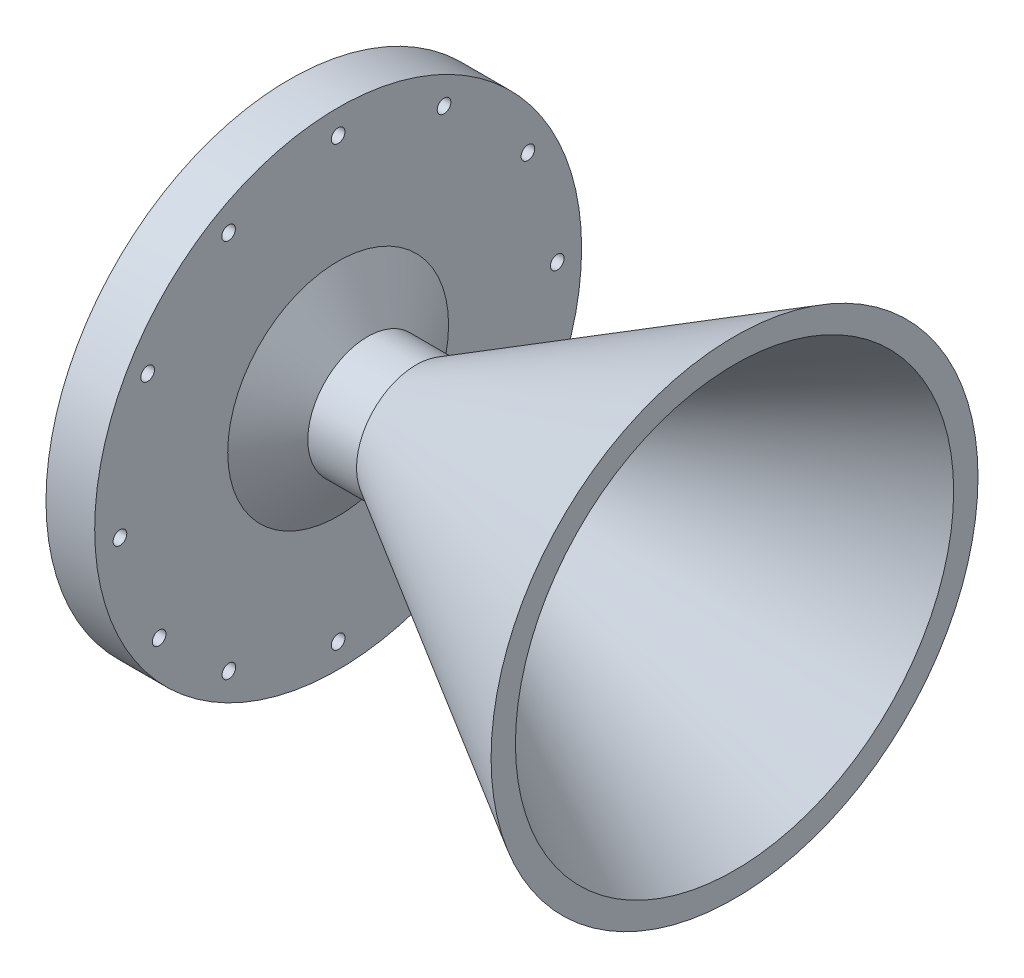
ISO-10303-21;
HEADER;
FILE_DESCRIPTION(('STEP AP214'),'2;1');
FILE_NAME('part.step','',(''),(''),'','','');
FILE_SCHEMA(('AUTOMOTIVE_DESIGN { 1 0 10303 214 1 1 1 1 }'));
ENDSEC;
DATA;
#1=APPLICATION_CONTEXT('core data for automotive mechanical design processes');
#2=APPLICATION_PROTOCOL_DEFINITION('international standard','automotive_design',2000,#1);
#3=PRODUCT_CONTEXT('',#1,'mechanical');
#4=PRODUCT('Part','Part','',(#3));
#5=PRODUCT_RELATED_PRODUCT_CATEGORY('part','',(#4));
#6=PRODUCT_DEFINITION_FORMATION('','',#4);
#7=PRODUCT_DEFINITION_CONTEXT('part definition',#1,'design');
#8=PRODUCT_DEFINITION('design','',#6,#7);
#9=PRODUCT_DEFINITION_SHAPE('','',#8);
#10=(LENGTH_UNIT() NAMED_UNIT(*) SI_UNIT(.MILLI.,.METRE.));
#11=(NAMED_UNIT(*) PLANE_ANGLE_UNIT() SI_UNIT($,.RADIAN.));
#12=(NAMED_UNIT(*) SI_UNIT($,.STERADIAN.) SOLID_ANGLE_UNIT());
#13=UNCERTAINTY_MEASURE_WITH_UNIT(LENGTH_MEASURE(1.E-05),#10,'distance_accuracy_value','');
#14=(GEOMETRIC_REPRESENTATION_CONTEXT(3) GLOBAL_UNCERTAINTY_ASSIGNED_CONTEXT((#13)) GLOBAL_UNIT_ASSIGNED_CONTEXT((#10,
#11,#12)) REPRESENTATION_CONTEXT('',''));
#15=CARTESIAN_POINT('',(0.,0.,0.));
#16=DIRECTION('',(0.,0.,1.));
#17=DIRECTION('',(1.,0.,0.));
#18=AXIS2_PLACEMENT_3D('',#15,#16,#17);
#19=CARTESIAN_POINT('',(0.,0.,0.));
#20=DIRECTION('',(-1.,0.,0.));
#21=DIRECTION('',(0.,0.,1.));
#22=AXIS2_PLACEMENT_3D('',#19,#20,#21);
#23=CYLINDRICAL_SURFACE('',#22,15.5575);
#24=CARTESIAN_POINT('',(-12.7,0.,0.));
#25=DIRECTION('',(-1.,0.,0.));
#26=DIRECTION('',(0.,0.,1.));
#27=AXIS2_PLACEMENT_3D('',#24,#25,#26);
#28=CIRCLE('',#27,15.5575);
#29=CARTESIAN_POINT('',(-12.7,0.,15.5575));
#30=VERTEX_POINT('',#29);
#31=EDGE_CURVE('E10',#30,#30,#28,.T.);
#32=ORIENTED_EDGE('',*,*,#31,.F.);
#33=EDGE_LOOP('',(#32));
#34=FACE_BOUND('',#33,.T.);
#35=CARTESIAN_POINT('',(0.,0.,0.));
#36=DIRECTION('',(-1.,0.,0.));
#37=DIRECTION('',(0.,0.,1.));
#38=AXIS2_PLACEMENT_3D('',#35,#36,#37);
#39=CIRCLE('',#38,15.5575);
#40=CARTESIAN_POINT('',(0.,0.,-15.5575));
#41=VERTEX_POINT('',#40);
#42=EDGE_CURVE('E65',#41,#41,#39,.T.);
#43=ORIENTED_EDGE('',*,*,#42,.T.);
#44=EDGE_LOOP('',(#43));
#45=FACE_BOUND('',#44,.T.);
#46=ADVANCED_FACE('F31',(#34,#45),#23,.T.);
#47=CARTESIAN_POINT('',(-12.7,0.,0.));
#48=DIRECTION('',(-1.,0.,0.));
#49=DIRECTION('',(0.,0.,1.));
#50=AXIS2_PLACEMENT_3D('',#47,#48,#49);
#51=CONICAL_SURFACE('',#50,15.5575,1.04719755119659);
#52=CARTESIAN_POINT('',(-20.3472668619156,0.,0.));
#53=DIRECTION('',(-1.,0.,0.));
#54=DIRECTION('',(0.,0.,1.));
#55=AXIS2_PLACEMENT_3D('',#52,#53,#54);
#56=CIRCLE('',#55,28.8029547438755);
#57=CARTESIAN_POINT('',(-20.3472668619156,0.,28.8029547438755));
#58=VERTEX_POINT('',#57);
#59=EDGE_CURVE('E37',#58,#58,#56,.T.);
#60=ORIENTED_EDGE('',*,*,#59,.F.);
#61=EDGE_LOOP('',(#60));
#62=FACE_BOUND('',#61,.T.);
#63=ORIENTED_EDGE('',*,*,#31,.T.);
#64=EDGE_LOOP('',(#63));
#65=FACE_BOUND('',#64,.T.);
#66=ADVANCED_FACE('F189',(#62,#65),#51,.T.);
#67=CARTESIAN_POINT('',(-20.3472668619156,63.5,0.));
#68=DIRECTION('',(-1.,0.,0.));
#69=DIRECTION('',(0.,0.,1.));
#70=AXIS2_PLACEMENT_3D('',#67,#68,#69);
#71=PLANE('',#70);
#72=CARTESIAN_POINT('',(-20.3472668619156,-5.20556958766426,56.9124287416025));
#73=DIRECTION('',(-1.,0.,0.));
#74=DIRECTION('',(0.,0.,1.));
#75=AXIS2_PLACEMENT_3D('',#72,#73,#74);
#76=CIRCLE('',#75,1.778);
#77=CARTESIAN_POINT('',(-20.3472668619156,-5.20556958766426,58.6904287416025));
#78=VERTEX_POINT('',#77);
#79=EDGE_CURVE('E68',#78,#78,#76,.T.);
#80=ORIENTED_EDGE('',*,*,#79,.T.);
#81=EDGE_LOOP('',(#80));
#82=FACE_BOUND('',#81,.T.);
#83=CARTESIAN_POINT('',(-20.3472668619156,-57.15,0.));
#84=DIRECTION('',(-1.,0.,0.));
#85=DIRECTION('',(0.,0.,1.));
#86=AXIS2_PLACEMENT_3D('',#83,#84,#85);
#87=CIRCLE('',#86,1.778);
#88=CARTESIAN_POINT('',(-20.3472668619156,-57.15,1.778));
#89=VERTEX_POINT('',#88);
#90=EDGE_CURVE('E122',#89,#89,#87,.T.);
#91=ORIENTED_EDGE('',*,*,#90,.T.);
#92=EDGE_LOOP('',(#91));
#93=FACE_BOUND('',#92,.T.);
#94=CARTESIAN_POINT('',(-20.3472668619156,-49.5367663729066,28.4996715299681));
#95=DIRECTION('',(-1.,0.,0.));
#96=DIRECTION('',(0.,0.,1.));
#97=AXIS2_PLACEMENT_3D('',#94,#95,#96);
#98=CIRCLE('',#97,1.778);
#99=CARTESIAN_POINT('',(-20.3472668619156,-49.5367663729066,30.2776715299681));
#100=VERTEX_POINT('',#99);
#101=EDGE_CURVE('E128',#100,#100,#98,.T.);
#102=ORIENTED_EDGE('',*,*,#101,.T.);
#103=EDGE_LOOP('',(#102));
#104=FACE_BOUND('',#103,.T.);
#105=CARTESIAN_POINT('',(-20.3472668619156,-32.9643698748863,46.6848242874672));
#106=DIRECTION('',(-1.,0.,0.));
#107=DIRECTION('',(0.,0.,1.));
#108=AXIS2_PLACEMENT_3D('',#105,#106,#107);
#109=CIRCLE('',#108,1.778);
#110=CARTESIAN_POINT('',(-20.3472668619156,-32.9643698748863,48.4628242874672));
#111=VERTEX_POINT('',#110);
#112=EDGE_CURVE('E99',#111,#111,#109,.T.);
#113=ORIENTED_EDGE('',*,*,#112,.T.);
#114=EDGE_LOOP('',(#113));
#115=FACE_BOUND('',#114,.T.);
#116=CARTESIAN_POINT('',(-20.3472668619156,28.5750000000002,-49.4933518262805));
#117=DIRECTION('',(-1.,0.,0.));
#118=DIRECTION('',(0.,0.,1.));
#119=AXIS2_PLACEMENT_3D('',#116,#117,#118);
#120=CIRCLE('',#119,1.778);
#121=CARTESIAN_POINT('',(-20.3472668619156,28.5750000000002,-47.7153518262805));
#122=VERTEX_POINT('',#121);
#123=EDGE_CURVE('E86',#122,#122,#120,.T.);
#124=ORIENTED_EDGE('',*,*,#123,.T.);
#125=EDGE_LOOP('',(#124));
#126=FACE_BOUND('',#125,.T.);
#127=CARTESIAN_POINT('',(-20.3472668619156,50.0348664276743,-27.6158404102571));
#128=DIRECTION('',(-1.,0.,0.));
#129=DIRECTION('',(0.,0.,1.));
#130=AXIS2_PLACEMENT_3D('',#127,#128,#129);
#131=CIRCLE('',#130,1.778);
#132=CARTESIAN_POINT('',(-20.3472668619156,50.0348664276743,-25.8378404102571));
#133=VERTEX_POINT('',#132);
#134=EDGE_CURVE('E73',#133,#133,#131,.T.);
#135=ORIENTED_EDGE('',*,*,#134,.T.);
#136=EDGE_LOOP('',(#135));
#137=FACE_BOUND('',#136,.T.);
#138=CARTESIAN_POINT('',(-20.3472668619156,0.,-57.15));
#139=DIRECTION('',(-1.,0.,0.));
#140=DIRECTION('',(0.,0.,1.));
#141=AXIS2_PLACEMENT_3D('',#138,#139,#140);
#142=CIRCLE('',#141,1.778);
#143=CARTESIAN_POINT('',(-20.3472668619156,0.,-55.372));
#144=VERTEX_POINT('',#143);
#145=EDGE_CURVE('E72',#144,#144,#142,.T.);
#146=ORIENTED_EDGE('',*,*,#145,.T.);
#147=EDGE_LOOP('',(#146));
#148=FACE_BOUND('',#147,.T.);
#149=CARTESIAN_POINT('',(-20.3472668619156,57.15,0.));
#150=DIRECTION('',(-1.,0.,0.));
#151=DIRECTION('',(0.,0.,1.));
#152=AXIS2_PLACEMENT_3D('',#149,#150,#151);
#153=CIRCLE('',#152,1.778);
#154=CARTESIAN_POINT('',(-20.3472668619156,57.15,1.778));
#155=VERTEX_POINT('',#154);
#156=EDGE_CURVE('E79',#155,#155,#153,.T.);
#157=ORIENTED_EDGE('',*,*,#156,.T.);
#158=EDGE_LOOP('',(#157));
#159=FACE_BOUND('',#158,.T.);
#160=CARTESIAN_POINT('',(-20.3472668619156,49.4933518262806,28.5750000000001));
#161=DIRECTION('',(-1.,0.,0.));
#162=DIRECTION('',(0.,0.,1.));
#163=AXIS2_PLACEMENT_3D('',#160,#161,#162);
#164=CIRCLE('',#163,1.778);
#165=CARTESIAN_POINT('',(-20.3472668619156,49.4933518262806,30.3530000000001));
#166=VERTEX_POINT('',#165);
#167=EDGE_CURVE('E87',#166,#166,#164,.T.);
#168=ORIENTED_EDGE('',*,*,#167,.T.);
#169=EDGE_LOOP('',(#168));
#170=FACE_BOUND('',#169,.T.);
#171=CARTESIAN_POINT('',(-20.3472668619156,28.2442482531311,49.6828435238514));
#172=DIRECTION('',(-1.,0.,0.));
#173=DIRECTION('',(0.,0.,1.));
#174=AXIS2_PLACEMENT_3D('',#171,#172,#173);
#175=CIRCLE('',#174,1.778);
#176=CARTESIAN_POINT('',(-20.3472668619156,28.2442482531311,51.4608435238514));
#177=VERTEX_POINT('',#176);
#178=EDGE_CURVE('E111',#177,#177,#175,.T.);
#179=ORIENTED_EDGE('',*,*,#178,.T.);
#180=EDGE_LOOP('',(#179));
#181=FACE_BOUND('',#180,.T.);
#182=CARTESIAN_POINT('',(-20.3472668619156,-48.3169724601523,-30.5220030844124));
#183=DIRECTION('',(-1.,0.,0.));
#184=DIRECTION('',(0.,0.,1.));
#185=AXIS2_PLACEMENT_3D('',#182,#183,#184);
#186=CIRCLE('',#185,1.778);
#187=CARTESIAN_POINT('',(-20.3472668619156,-48.3169724601523,-28.7440030844124));
#188=VERTEX_POINT('',#187);
#189=EDGE_CURVE('E105',#188,#188,#186,.T.);
#190=ORIENTED_EDGE('',*,*,#189,.T.);
#191=EDGE_LOOP('',(#190));
#192=FACE_BOUND('',#191,.T.);
#193=CARTESIAN_POINT('',(-20.3472668619156,-27.6158404102573,-50.0348664276742));
#194=DIRECTION('',(-1.,0.,0.));
#195=DIRECTION('',(0.,0.,1.));
#196=AXIS2_PLACEMENT_3D('',#193,#194,#195);
#197=CIRCLE('',#196,1.778);
#198=CARTESIAN_POINT('',(-20.3472668619156,-27.6158404102573,-48.2568664276742));
#199=VERTEX_POINT('',#198);
#200=EDGE_CURVE('E98',#199,#199,#197,.T.);
#201=ORIENTED_EDGE('',*,*,#200,.T.);
#202=EDGE_LOOP('',(#201));
#203=FACE_BOUND('',#202,.T.);
#204=CARTESIAN_POINT('',(-20.3472668619156,0.,0.));
#205=DIRECTION('',(-1.,0.,0.));
#206=DIRECTION('',(0.,0.,1.));
#207=AXIS2_PLACEMENT_3D('',#204,#205,#206);
#208=CIRCLE('',#207,63.5);
#209=CARTESIAN_POINT('',(-20.3472668619156,0.,63.5));
#210=VERTEX_POINT('',#209);
#211=EDGE_CURVE('E41',#210,#210,#208,.T.);
#212=ORIENTED_EDGE('',*,*,#211,.F.);
#213=EDGE_LOOP('',(#212));
#214=FACE_BOUND('',#213,.T.);
#215=ORIENTED_EDGE('',*,*,#59,.T.);
#216=EDGE_LOOP('',(#215));
#217=FACE_BOUND('',#216,.T.);
#218=ADVANCED_FACE('F141',(#82,#93,#104,#115,#126,#137,#148,#159,#170,#181,#192,#203,#214,#217),
#71,.F.);
#219=CARTESIAN_POINT('',(0.,0.,0.));
#220=DIRECTION('',(-1.,0.,0.));
#221=DIRECTION('',(0.,0.,1.));
#222=AXIS2_PLACEMENT_3D('',#219,#220,#221);
#223=CYLINDRICAL_SURFACE('',#222,63.5);
#224=CARTESIAN_POINT('',(-33.0472668619156,0.,0.));
#225=DIRECTION('',(-1.,0.,0.));
#226=DIRECTION('',(0.,0.,1.));
#227=AXIS2_PLACEMENT_3D('',#224,#225,#226);
#228=CIRCLE('',#227,63.5);
#229=CARTESIAN_POINT('',(-33.0472668619156,0.,63.5));
#230=VERTEX_POINT('',#229);
#231=EDGE_CURVE('E45',#230,#230,#228,.T.);
#232=ORIENTED_EDGE('',*,*,#231,.F.);
#233=EDGE_LOOP('',(#232));
#234=FACE_BOUND('',#233,.T.);
#235=ORIENTED_EDGE('',*,*,#211,.T.);
#236=EDGE_LOOP('',(#235));
#237=FACE_BOUND('',#236,.T.);
#238=ADVANCED_FACE('F155',(#234,#237),#223,.T.);
#239=CARTESIAN_POINT('',(-33.0472668619156,50.8,0.));
#240=DIRECTION('',(1.,0.,0.));
#241=DIRECTION('',(0.,0.,-1.));
#242=AXIS2_PLACEMENT_3D('',#239,#240,#241);
#243=PLANE('',#242);
#244=CARTESIAN_POINT('',(-33.0472668619156,-5.20556958766426,56.9124287416025));
#245=DIRECTION('',(-1.,0.,0.));
#246=DIRECTION('',(0.,0.,1.));
#247=AXIS2_PLACEMENT_3D('',#244,#245,#246);
#248=CIRCLE('',#247,1.778);
#249=CARTESIAN_POINT('',(-33.0472668619156,-5.20556958766426,58.6904287416025));
#250=VERTEX_POINT('',#249);
#251=EDGE_CURVE('E82',#250,#250,#248,.T.);
#252=ORIENTED_EDGE('',*,*,#251,.F.);
#253=EDGE_LOOP('',(#252));
#254=FACE_BOUND('',#253,.T.);
#255=CARTESIAN_POINT('',(-33.0472668619156,-57.15,0.));
#256=DIRECTION('',(-1.,0.,0.));
#257=DIRECTION('',(0.,0.,1.));
#258=AXIS2_PLACEMENT_3D('',#255,#256,#257);
#259=CIRCLE('',#258,1.778);
#260=CARTESIAN_POINT('',(-33.0472668619156,-57.15,1.778));
#261=VERTEX_POINT('',#260);
#262=EDGE_CURVE('E119',#261,#261,#259,.T.);
#263=ORIENTED_EDGE('',*,*,#262,.F.);
#264=EDGE_LOOP('',(#263));
#265=FACE_BOUND('',#264,.T.);
#266=CARTESIAN_POINT('',(-33.0472668619156,-49.5367663729066,28.4996715299681));
#267=DIRECTION('',(-1.,0.,0.));
#268=DIRECTION('',(0.,0.,1.));
#269=AXIS2_PLACEMENT_3D('',#266,#267,#268);
#270=CIRCLE('',#269,1.778);
#271=CARTESIAN_POINT('',(-33.0472668619156,-49.5367663729066,30.2776715299681));
#272=VERTEX_POINT('',#271);
#273=EDGE_CURVE('E125',#272,#272,#270,.T.);
#274=ORIENTED_EDGE('',*,*,#273,.F.);
#275=EDGE_LOOP('',(#274));
#276=FACE_BOUND('',#275,.T.);
#277=CARTESIAN_POINT('',(-33.0472668619156,-32.9643698748863,46.6848242874672));
#278=DIRECTION('',(-1.,0.,0.));
#279=DIRECTION('',(0.,0.,1.));
#280=AXIS2_PLACEMENT_3D('',#277,#278,#279);
#281=CIRCLE('',#280,1.778);
#282=CARTESIAN_POINT('',(-33.0472668619156,-32.9643698748863,48.4628242874672));
#283=VERTEX_POINT('',#282);
#284=EDGE_CURVE('E131',#283,#283,#281,.T.);
#285=ORIENTED_EDGE('',*,*,#284,.F.);
#286=EDGE_LOOP('',(#285));
#287=FACE_BOUND('',#286,.T.);
#288=CARTESIAN_POINT('',(-33.0472668619156,28.5750000000002,-49.4933518262805));
#289=DIRECTION('',(-1.,0.,0.));
#290=DIRECTION('',(0.,0.,1.));
#291=AXIS2_PLACEMENT_3D('',#288,#289,#290);
#292=CIRCLE('',#291,1.778);
#293=CARTESIAN_POINT('',(-33.0472668619156,28.5750000000002,-47.7153518262805));
#294=VERTEX_POINT('',#293);
#295=EDGE_CURVE('E83',#294,#294,#292,.T.);
#296=ORIENTED_EDGE('',*,*,#295,.F.);
#297=EDGE_LOOP('',(#296));
#298=FACE_BOUND('',#297,.T.);
#299=CARTESIAN_POINT('',(-33.0472668619156,50.0348664276743,-27.6158404102571));
#300=DIRECTION('',(-1.,0.,0.));
#301=DIRECTION('',(0.,0.,1.));
#302=AXIS2_PLACEMENT_3D('',#299,#300,#301);
#303=CIRCLE('',#302,1.778);
#304=CARTESIAN_POINT('',(-33.0472668619156,50.0348664276743,-25.8378404102571));
#305=VERTEX_POINT('',#304);
#306=EDGE_CURVE('E90',#305,#305,#303,.T.);
#307=ORIENTED_EDGE('',*,*,#306,.F.);
#308=EDGE_LOOP('',(#307));
#309=FACE_BOUND('',#308,.T.);
#310=CARTESIAN_POINT('',(-33.0472668619156,0.,-57.15));
#311=DIRECTION('',(-1.,0.,0.));
#312=DIRECTION('',(0.,0.,1.));
#313=AXIS2_PLACEMENT_3D('',#310,#311,#312);
#314=CIRCLE('',#313,1.778);
#315=CARTESIAN_POINT('',(-33.0472668619156,0.,-55.372));
#316=VERTEX_POINT('',#315);
#317=EDGE_CURVE('E69',#316,#316,#314,.T.);
#318=ORIENTED_EDGE('',*,*,#317,.F.);
#319=EDGE_LOOP('',(#318));
#320=FACE_BOUND('',#319,.T.);
#321=CARTESIAN_POINT('',(-33.0472668619156,57.15,0.));
#322=DIRECTION('',(-1.,0.,0.));
#323=DIRECTION('',(0.,0.,1.));
#324=AXIS2_PLACEMENT_3D('',#321,#322,#323);
#325=CIRCLE('',#324,1.778);
#326=CARTESIAN_POINT('',(-33.0472668619156,57.15,1.778));
#327=VERTEX_POINT('',#326);
#328=EDGE_CURVE('E76',#327,#327,#325,.T.);
#329=ORIENTED_EDGE('',*,*,#328,.F.);
#330=EDGE_LOOP('',(#329));
#331=FACE_BOUND('',#330,.T.);
#332=CARTESIAN_POINT('',(-33.0472668619156,49.4933518262806,28.5750000000001));
#333=DIRECTION('',(-1.,0.,0.));
#334=DIRECTION('',(0.,0.,1.));
#335=AXIS2_PLACEMENT_3D('',#332,#333,#334);
#336=CIRCLE('',#335,1.778);
#337=CARTESIAN_POINT('',(-33.0472668619156,49.4933518262806,30.3530000000001));
#338=VERTEX_POINT('',#337);
#339=EDGE_CURVE('E114',#338,#338,#336,.T.);
#340=ORIENTED_EDGE('',*,*,#339,.F.);
#341=EDGE_LOOP('',(#340));
#342=FACE_BOUND('',#341,.T.);
#343=CARTESIAN_POINT('',(-33.0472668619156,28.2442482531311,49.6828435238514));
#344=DIRECTION('',(-1.,0.,0.));
#345=DIRECTION('',(0.,0.,1.));
#346=AXIS2_PLACEMENT_3D('',#343,#344,#345);
#347=CIRCLE('',#346,1.778);
#348=CARTESIAN_POINT('',(-33.0472668619156,28.2442482531311,51.4608435238514));
#349=VERTEX_POINT('',#348);
#350=EDGE_CURVE('E108',#349,#349,#347,.T.);
#351=ORIENTED_EDGE('',*,*,#350,.F.);
#352=EDGE_LOOP('',(#351));
#353=FACE_BOUND('',#352,.T.);
#354=CARTESIAN_POINT('',(-33.0472668619156,-48.3169724601523,-30.5220030844124));
#355=DIRECTION('',(-1.,0.,0.));
#356=DIRECTION('',(0.,0.,1.));
#357=AXIS2_PLACEMENT_3D('',#354,#355,#356);
#358=CIRCLE('',#357,1.778);
#359=CARTESIAN_POINT('',(-33.0472668619156,-48.3169724601523,-28.7440030844124));
#360=VERTEX_POINT('',#359);
#361=EDGE_CURVE('E102',#360,#360,#358,.T.);
#362=ORIENTED_EDGE('',*,*,#361,.F.);
#363=EDGE_LOOP('',(#362));
#364=FACE_BOUND('',#363,.T.);
#365=CARTESIAN_POINT('',(-33.0472668619156,-27.6158404102573,-50.0348664276742));
#366=DIRECTION('',(-1.,0.,0.));
#367=DIRECTION('',(0.,0.,1.));
#368=AXIS2_PLACEMENT_3D('',#365,#366,#367);
#369=CIRCLE('',#368,1.778);
#370=CARTESIAN_POINT('',(-33.0472668619156,-27.6158404102573,-48.2568664276742));
#371=VERTEX_POINT('',#370);
#372=EDGE_CURVE('E95',#371,#371,#369,.T.);
#373=ORIENTED_EDGE('',*,*,#372,.F.);
#374=EDGE_LOOP('',(#373));
#375=FACE_BOUND('',#374,.T.);
#376=CARTESIAN_POINT('',(-33.0472668619156,0.,0.));
#377=DIRECTION('',(-1.,0.,0.));
#378=DIRECTION('',(0.,0.,1.));
#379=AXIS2_PLACEMENT_3D('',#376,#377,#378);
#380=CIRCLE('',#379,44.45);
#381=CARTESIAN_POINT('',(-33.0472668619156,0.,44.45));
#382=VERTEX_POINT('',#381);
#383=EDGE_CURVE('E50',#382,#382,#380,.T.);
#384=ORIENTED_EDGE('',*,*,#383,.F.);
#385=EDGE_LOOP('',(#384));
#386=FACE_BOUND('',#385,.T.);
#387=ORIENTED_EDGE('',*,*,#231,.T.);
#388=EDGE_LOOP('',(#387));
#389=FACE_BOUND('',#388,.T.);
#390=ADVANCED_FACE('F151',(#254,#265,#276,#287,#298,#309,#320,#331,#342,#353,#364,#375,#386,
#389),#243,.F.);
#391=CARTESIAN_POINT('',(-33.0472668619156,0.,0.));
#392=DIRECTION('',(-1.,0.,0.));
#393=DIRECTION('',(0.,0.,1.));
#394=AXIS2_PLACEMENT_3D('',#391,#392,#393);
#395=CONICAL_SURFACE('',#394,44.45,1.0623898104101);
#396=CARTESIAN_POINT('',(-12.7,0.,0.));
#397=DIRECTION('',(-1.,0.,0.));
#398=DIRECTION('',(0.,0.,1.));
#399=AXIS2_PLACEMENT_3D('',#396,#397,#398);
#400=CIRCLE('',#399,7.9375);
#401=CARTESIAN_POINT('',(-12.7,0.,7.9375));
#402=VERTEX_POINT('',#401);
#403=EDGE_CURVE('E53',#402,#402,#400,.T.);
#404=CARTESIAN_POINT('',(-12.7,0.,7.9375));
#405=CARTESIAN_POINT('',(-12.9119506964783,0.,8.31783854166667));
#406=CARTESIAN_POINT('',(-13.1239013929566,0.,8.69817708333333));
#407=CARTESIAN_POINT('',(-13.5478027859131,0.,9.45885416666666));
#408=CARTESIAN_POINT('',(-13.7597534823914,0.,9.83919270833333));
#409=CARTESIAN_POINT('',(-14.183654875348,0.,10.5998697916667));
#410=CARTESIAN_POINT('',(-14.3956055718263,0.,10.9802083333333));
#411=CARTESIAN_POINT('',(-14.8195069647829,0.,11.7408854166667));
#412=CARTESIAN_POINT('',(-15.0314576612612,0.,12.1212239583333));
#413=CARTESIAN_POINT('',(-15.4553590542177,0.,12.8819010416667));
#414=CARTESIAN_POINT('',(-15.667309750696,0.,13.2622395833333));
#415=CARTESIAN_POINT('',(-16.0912111436526,0.,14.0229166666667));
#416=CARTESIAN_POINT('',(-16.3031618401309,0.,14.4032552083333));
#417=CARTESIAN_POINT('',(-16.7270632330875,0.,15.1639322916667));
#418=CARTESIAN_POINT('',(-16.9390139295658,0.,15.5442708333333));
#419=CARTESIAN_POINT('',(-17.3629153225223,0.,16.3049479166667));
#420=CARTESIAN_POINT('',(-17.5748660190006,0.,16.6852864583333));
#421=CARTESIAN_POINT('',(-17.9987674119572,0.,17.4459635416667));
#422=CARTESIAN_POINT('',(-18.2107181084355,0.,17.8263020833333));
#423=CARTESIAN_POINT('',(-18.6346195013921,0.,18.5869791666667));
#424=CARTESIAN_POINT('',(-18.8465701978703,0.,18.9673177083333));
#425=CARTESIAN_POINT('',(-19.2704715908269,0.,19.7279947916667));
#426=CARTESIAN_POINT('',(-19.4824222873052,0.,20.1083333333333));
#427=CARTESIAN_POINT('',(-19.9063236802618,0.,20.8690104166667));
#428=CARTESIAN_POINT('',(-20.1182743767401,0.,21.2493489583333));
#429=CARTESIAN_POINT('',(-20.5421757696966,0.,22.0100260416667));
#430=CARTESIAN_POINT('',(-20.7541264661749,0.,22.3903645833333));
#431=CARTESIAN_POINT('',(-21.1780278591315,0.,23.1510416666667));
#432=CARTESIAN_POINT('',(-21.3899785556098,0.,23.5313802083333));
#433=CARTESIAN_POINT('',(-21.8138799485664,0.,24.2920572916667));
#434=CARTESIAN_POINT('',(-22.0258306450447,0.,24.6723958333333));
#435=CARTESIAN_POINT('',(-22.4497320380012,0.,25.4330729166667));
#436=CARTESIAN_POINT('',(-22.6616827344795,0.,25.8134114583333));
#437=CARTESIAN_POINT('',(-23.0855841274361,0.,26.5740885416667));
#438=CARTESIAN_POINT('',(-23.2975348239144,0.,26.9544270833333));
#439=CARTESIAN_POINT('',(-23.721436216871,0.,27.7151041666667));
#440=CARTESIAN_POINT('',(-23.9333869133493,0.,28.0954427083333));
#441=CARTESIAN_POINT('',(-24.3572883063058,0.,28.8561197916667));
#442=CARTESIAN_POINT('',(-24.5692390027841,0.,29.2364583333333));
#443=CARTESIAN_POINT('',(-24.9931403957407,0.,29.9971354166667));
#444=CARTESIAN_POINT('',(-25.205091092219,0.,30.3774739583333));
#445=CARTESIAN_POINT('',(-25.6289924851755,0.,31.1381510416667));
#446=CARTESIAN_POINT('',(-25.8409431816538,0.,31.5184895833333));
#447=CARTESIAN_POINT('',(-26.2648445746104,0.,32.2791666666667));
#448=CARTESIAN_POINT('',(-26.4767952710887,0.,32.6595052083333));
#449=CARTESIAN_POINT('',(-26.9006966640453,0.,33.4201822916667));
#450=CARTESIAN_POINT('',(-27.1126473605236,0.,33.8005208333333));
#451=CARTESIAN_POINT('',(-27.5365487534801,0.,34.5611979166667));
#452=CARTESIAN_POINT('',(-27.7484994499584,0.,34.9415364583333));
#453=CARTESIAN_POINT('',(-28.172400842915,0.,35.7022135416667));
#454=CARTESIAN_POINT('',(-28.3843515393933,0.,36.0825520833333));
#455=CARTESIAN_POINT('',(-28.8082529323499,0.,36.8432291666667));
#456=CARTESIAN_POINT('',(-29.0202036288282,0.,37.2235677083333));
#457=CARTESIAN_POINT('',(-29.4441050217847,0.,37.9842447916667));
#458=CARTESIAN_POINT('',(-29.656055718263,0.,38.3645833333333));
#459=CARTESIAN_POINT('',(-30.0799571112196,0.,39.1252604166667));
#460=CARTESIAN_POINT('',(-30.2919078076979,0.,39.5055989583333));
#461=CARTESIAN_POINT('',(-30.7158092006545,0.,40.2662760416667));
#462=CARTESIAN_POINT('',(-30.9277598971327,0.,40.6466145833333));
#463=CARTESIAN_POINT('',(-31.3516612900893,0.,41.4072916666667));
#464=CARTESIAN_POINT('',(-31.5636119865676,0.,41.7876302083333));
#465=CARTESIAN_POINT('',(-31.9875133795242,0.,42.5483072916667));
#466=CARTESIAN_POINT('',(-32.1994640760025,0.,42.9286458333333));
#467=CARTESIAN_POINT('',(-32.623365468959,0.,43.6893229166667));
#468=CARTESIAN_POINT('',(-32.8353161654373,0.,44.0696614583333));
#469=CARTESIAN_POINT('',(-33.0472668619156,0.,44.45));
#470=B_SPLINE_CURVE_WITH_KNOTS('',3,(#404,#405,#406,#407,#408,#409,#410,#411,#412,#413,#414,
#415,#416,#417,#418,#419,#420,#421,#422,#423,#424,#425,#426,#427,#428,#429,#430,#431,#432,#433,
#434,#435,#436,#437,#438,#439,#440,#441,#442,#443,#444,#445,#446,#447,#448,#449,#450,#451,#452,
#453,#454,#455,#456,#457,#458,#459,#460,#461,#462,#463,#464,#465,#466,#467,#468,#469),
.UNSPECIFIED.,.F.,.F.,(4,2,2,2,2,2,2,2,2,2,2,2,2,2,2,2,2,2,2,2,2,2,2,2,2,2,2,2,2,2,2,2,4),(0.,
1.30622530067857,2.61245060135714,3.91867590203571,5.22490120271428,6.53112650339285,
7.83735180407142,9.14357710474999,10.4498024054286,11.7560277061071,13.0622530067857,
14.3684783074643,15.6747036081428,16.9809289088214,18.2871542095,19.5933795101786,
20.8996048108571,22.2058301115357,23.5120554122143,24.8182807128928,26.1245060135714,
27.43073131425,28.7369566149285,30.0431819156071,31.3494072162857,32.6556325169643,
33.9618578176428,35.2680831183214,36.574308419,37.8805337196785,39.1867590203571,
40.4929843210357,41.7992096217142),.UNSPECIFIED.);
#471=EDGE_CURVE('BSEAM154',#402,#382,#470,.T.);
#472=ORIENTED_EDGE('',*,*,#403,.F.);
#473=ORIENTED_EDGE('',*,*,#383,.T.);
#474=ORIENTED_EDGE('',*,*,#471,.T.);
#475=ORIENTED_EDGE('',*,*,#471,.F.);
#476=EDGE_LOOP('',(#472,#474,#473,#475));
#477=FACE_BOUND('',#476,.T.);
#478=ADVANCED_FACE('F154',(#477),#395,.F.);
#479=CARTESIAN_POINT('',(0.,0.,0.));
#480=DIRECTION('',(-1.,0.,0.));
#481=DIRECTION('',(0.,0.,1.));
#482=AXIS2_PLACEMENT_3D('',#479,#480,#481);
#483=CYLINDRICAL_SURFACE('',#482,7.9375);
#484=CARTESIAN_POINT('',(0.,0.,0.));
#485=DIRECTION('',(-1.,0.,0.));
#486=DIRECTION('',(0.,0.,1.));
#487=AXIS2_PLACEMENT_3D('',#484,#485,#486);
#488=CIRCLE('',#487,7.9375);
#489=CARTESIAN_POINT('',(0.,0.,-7.9375));
#490=VERTEX_POINT('',#489);
#491=EDGE_CURVE('E56',#490,#490,#488,.T.);
#492=ORIENTED_EDGE('',*,*,#491,.F.);
#493=EDGE_LOOP('',(#492));
#494=FACE_BOUND('',#493,.T.);
#495=ORIENTED_EDGE('',*,*,#403,.T.);
#496=EDGE_LOOP('',(#495));
#497=FACE_BOUND('',#496,.T.);
#498=ADVANCED_FACE('F219',(#494,#497),#483,.F.);
#499=CARTESIAN_POINT('',(0.,0.,0.));
#500=DIRECTION('',(1.,0.,0.));
#501=DIRECTION('',(0.,0.,-1.));
#502=AXIS2_PLACEMENT_3D('',#499,#500,#501);
#503=CONICAL_SURFACE('',#502,7.9375,0.534993353531431);
#504=CARTESIAN_POINT('',(83.0388458418706,0.,0.));
#505=DIRECTION('',(-1.,0.,0.));
#506=DIRECTION('',(0.,0.,1.));
#507=AXIS2_PLACEMENT_3D('',#504,#505,#506);
#508=CIRCLE('',#507,57.15);
#509=CARTESIAN_POINT('',(83.0388458418706,0.,-57.15));
#510=VERTEX_POINT('',#509);
#511=EDGE_CURVE('E59',#510,#510,#508,.T.);
#512=CARTESIAN_POINT('',(83.0388458418706,0.,-57.15));
#513=CARTESIAN_POINT('',(82.1738578643511,0.,-56.6373697916667));
#514=CARTESIAN_POINT('',(81.3088698868317,0.,-56.1247395833333));
#515=CARTESIAN_POINT('',(79.5788939317927,0.,-55.0994791666667));
#516=CARTESIAN_POINT('',(78.7139059542732,0.,-54.5868489583333));
#517=CARTESIAN_POINT('',(76.9839299992342,0.,-53.5615885416667));
#518=CARTESIAN_POINT('',(76.1189420217147,0.,-53.0489583333333));
#519=CARTESIAN_POINT('',(74.3889660666758,0.,-52.0236979166667));
#520=CARTESIAN_POINT('',(73.5239780891563,0.,-51.5110677083333));
#521=CARTESIAN_POINT('',(71.7940021341173,0.,-50.4858072916667));
#522=CARTESIAN_POINT('',(70.9290141565978,0.,-49.9731770833333));
#523=CARTESIAN_POINT('',(69.1990382015589,0.,-48.9479166666667));
#524=CARTESIAN_POINT('',(68.3340502240394,0.,-48.4352864583333));
#525=CARTESIAN_POINT('',(66.6040742690004,0.,-47.4100260416667));
#526=CARTESIAN_POINT('',(65.7390862914809,0.,-46.8973958333333));
#527=CARTESIAN_POINT('',(64.0091103364419,0.,-45.8721354166667));
#528=CARTESIAN_POINT('',(63.1441223589225,0.,-45.3595052083333));
#529=CARTESIAN_POINT('',(61.4141464038835,0.,-44.3342447916667));
#530=CARTESIAN_POINT('',(60.549158426364,0.,-43.8216145833333));
#531=CARTESIAN_POINT('',(58.819182471325,0.,-42.7963541666667));
#532=CARTESIAN_POINT('',(57.9541944938055,0.,-42.2837239583333));
#533=CARTESIAN_POINT('',(56.2242185387666,0.,-41.2584635416667));
#534=CARTESIAN_POINT('',(55.3592305612471,0.,-40.7458333333333));
#535=CARTESIAN_POINT('',(53.6292546062081,0.,-39.7205729166667));
#536=CARTESIAN_POINT('',(52.7642666286886,0.,-39.2079427083333));
#537=CARTESIAN_POINT('',(51.0342906736497,0.,-38.1826822916667));
#538=CARTESIAN_POINT('',(50.1693026961302,0.,-37.6700520833333));
#539=CARTESIAN_POINT('',(48.4393267410912,0.,-36.6447916666667));
#540=CARTESIAN_POINT('',(47.5743387635717,0.,-36.1321614583333));
#541=CARTESIAN_POINT('',(45.8443628085327,0.,-35.1069010416667));
#542=CARTESIAN_POINT('',(44.9793748310133,0.,-34.5942708333333));
#543=CARTESIAN_POINT('',(43.2493988759743,0.,-33.5690104166667));
#544=CARTESIAN_POINT('',(42.3844108984548,0.,-33.0563802083333));
#545=CARTESIAN_POINT('',(40.6544349434158,0.,-32.0311197916667));
#546=CARTESIAN_POINT('',(39.7894469658963,0.,-31.5184895833333));
#547=CARTESIAN_POINT('',(38.0594710108574,0.,-30.4932291666667));
#548=CARTESIAN_POINT('',(37.1944830333379,0.,-29.9805989583333));
#549=CARTESIAN_POINT('',(35.4645070782989,0.,-28.9553385416667));
#550=CARTESIAN_POINT('',(34.5995191007794,0.,-28.4427083333333));
#551=CARTESIAN_POINT('',(32.8695431457405,0.,-27.4174479166667));
#552=CARTESIAN_POINT('',(32.004555168221,0.,-26.9048177083333));
#553=CARTESIAN_POINT('',(30.274579213182,0.,-25.8795572916667));
#554=CARTESIAN_POINT('',(29.4095912356625,0.,-25.3669270833333));
#555=CARTESIAN_POINT('',(27.6796152806235,0.,-24.3416666666667));
#556=CARTESIAN_POINT('',(26.8146273031041,0.,-23.8290364583333));
#557=CARTESIAN_POINT('',(25.0846513480651,0.,-22.8037760416667));
#558=CARTESIAN_POINT('',(24.2196633705456,0.,-22.2911458333333));
#559=CARTESIAN_POINT('',(22.4896874155066,0.,-21.2658854166667));
#560=CARTESIAN_POINT('',(21.6246994379871,0.,-20.7532552083333));
#561=CARTESIAN_POINT('',(19.8947234829482,0.,-19.7279947916667));
#562=CARTESIAN_POINT('',(19.0297355054287,0.,-19.2153645833333));
#563=CARTESIAN_POINT('',(17.2997595503897,0.,-18.1901041666667));
#564=CARTESIAN_POINT('',(16.4347715728702,0.,-17.6774739583333));
#565=CARTESIAN_POINT('',(14.7047956178313,0.,-16.6522135416667));
#566=CARTESIAN_POINT('',(13.8398076403118,0.,-16.1395833333333));
#567=CARTESIAN_POINT('',(12.1098316852728,0.,-15.1143229166667));
#568=CARTESIAN_POINT('',(11.2448437077533,0.,-14.6016927083333));
#569=CARTESIAN_POINT('',(9.51486775271434,0.,-13.5764322916667));
#570=CARTESIAN_POINT('',(8.64987977519486,0.,-13.0638020833333));
#571=CARTESIAN_POINT('',(6.91990382015589,0.,-12.0385416666667));
#572=CARTESIAN_POINT('',(6.0549158426364,0.,-11.5259114583333));
#573=CARTESIAN_POINT('',(4.32493988759743,0.,-10.5006510416667));
#574=CARTESIAN_POINT('',(3.45995191007794,0.,-9.98802083333333));
#575=CARTESIAN_POINT('',(1.72997595503897,0.,-8.96276041666667));
#576=CARTESIAN_POINT('',(0.864987977519484,0.,-8.45013020833333));
#577=CARTESIAN_POINT('',(0.,0.,-7.9375));
#578=B_SPLINE_CURVE_WITH_KNOTS('',3,(#512,#513,#514,#515,#516,#517,#518,#519,#520,#521,#522,
#523,#524,#525,#526,#527,#528,#529,#530,#531,#532,#533,#534,#535,#536,#537,#538,#539,#540,#541,
#542,#543,#544,#545,#546,#547,#548,#549,#550,#551,#552,#553,#554,#555,#556,#557,#558,#559,#560,
#561,#562,#563,#564,#565,#566,#567,#568,#569,#570,#571,#572,#573,#574,#575,#576,#577),
.UNSPECIFIED.,.F.,.F.,(4,2,2,2,2,2,2,2,2,2,2,2,2,2,2,2,2,2,2,2,2,2,2,2,2,2,2,2,2,2,2,2,4),(0.,
3.01644582012376,6.03289164024754,9.0493374603713,12.0657832804951,15.0822291006188,
18.0986749207426,21.1151207408664,24.1315665609901,27.1480123811139,30.1644582012377,
33.1809040213614,36.1973498414852,39.2137956616089,42.2302414817327,45.2466873018565,
48.2631331219803,51.279578942104,54.2960247622278,57.3124705823516,60.3289164024753,
63.3453622225991,66.3618080427229,69.3782538628466,72.3946996829704,75.4111455030942,
78.4275913232179,81.4440371433417,84.4604829634655,87.4769287835892,90.493374603713,
93.5098204238368,96.5262662439606),.UNSPECIFIED.);
#579=EDGE_CURVE('BSEAM213',#510,#490,#578,.T.);
#580=ORIENTED_EDGE('',*,*,#511,.F.);
#581=ORIENTED_EDGE('',*,*,#491,.T.);
#582=ORIENTED_EDGE('',*,*,#579,.T.);
#583=ORIENTED_EDGE('',*,*,#579,.F.);
#584=EDGE_LOOP('',(#580,#582,#581,#583));
#585=FACE_BOUND('',#584,.T.);
#586=ADVANCED_FACE('F213',(#585),#503,.F.);
#587=CARTESIAN_POINT('',(83.0388458418706,63.5,0.));
#588=DIRECTION('',(-1.,0.,0.));
#589=DIRECTION('',(0.,0.,1.));
#590=AXIS2_PLACEMENT_3D('',#587,#588,#589);
#591=PLANE('',#590);
#592=CARTESIAN_POINT('',(83.0388458418706,0.,0.));
#593=DIRECTION('',(-1.,0.,0.));
#594=DIRECTION('',(0.,0.,1.));
#595=AXIS2_PLACEMENT_3D('',#592,#593,#594);
#596=CIRCLE('',#595,63.5);
#597=CARTESIAN_POINT('',(83.0388458418706,0.,-63.5));
#598=VERTEX_POINT('',#597);
#599=EDGE_CURVE('E62',#598,#598,#596,.T.);
#600=ORIENTED_EDGE('',*,*,#599,.F.);
#601=EDGE_LOOP('',(#600));
#602=FACE_BOUND('',#601,.T.);
#603=ORIENTED_EDGE('',*,*,#511,.T.);
#604=EDGE_LOOP('',(#603));
#605=FACE_BOUND('',#604,.T.);
#606=ADVANCED_FACE('F207',(#602,#605),#591,.F.);
#607=CARTESIAN_POINT('',(83.0388458418706,0.,0.));
#608=DIRECTION('',(1.,0.,0.));
#609=DIRECTION('',(0.,0.,-1.));
#610=AXIS2_PLACEMENT_3D('',#607,#608,#609);
#611=CONICAL_SURFACE('',#610,63.5,0.5235987755983);
#612=CARTESIAN_POINT('',(0.,0.,-15.5575));
#613=CARTESIAN_POINT('',(0.864987977519469,0.,-16.0569010416667));
#614=CARTESIAN_POINT('',(1.72997595503895,0.,-16.5563020833333));
#615=CARTESIAN_POINT('',(3.45995191007793,0.,-17.5551041666667));
#616=CARTESIAN_POINT('',(4.32493988759742,0.,-18.0545052083333));
#617=CARTESIAN_POINT('',(6.05491584263639,0.,-19.0533072916667));
#618=CARTESIAN_POINT('',(6.91990382015587,0.,-19.5527083333333));
#619=CARTESIAN_POINT('',(8.64987977519484,0.,-20.5515104166667));
#620=CARTESIAN_POINT('',(9.51486775271433,0.,-21.0509114583333));
#621=CARTESIAN_POINT('',(11.2448437077533,0.,-22.0497135416667));
#622=CARTESIAN_POINT('',(12.1098316852728,0.,-22.5491145833333));
#623=CARTESIAN_POINT('',(13.8398076403118,0.,-23.5479166666667));
#624=CARTESIAN_POINT('',(14.7047956178312,0.,-24.0473177083333));
#625=CARTESIAN_POINT('',(16.4347715728702,0.,-25.0461197916667));
#626=CARTESIAN_POINT('',(17.2997595503897,0.,-25.5455208333333));
#627=CARTESIAN_POINT('',(19.0297355054287,0.,-26.5443229166667));
#628=CARTESIAN_POINT('',(19.8947234829482,0.,-27.0437239583333));
#629=CARTESIAN_POINT('',(21.6246994379871,0.,-28.0425260416667));
#630=CARTESIAN_POINT('',(22.4896874155066,0.,-28.5419270833333));
#631=CARTESIAN_POINT('',(24.2196633705456,0.,-29.5407291666667));
#632=CARTESIAN_POINT('',(25.0846513480651,0.,-30.0401302083333));
#633=CARTESIAN_POINT('',(26.814627303104,0.,-31.0389322916667));
#634=CARTESIAN_POINT('',(27.6796152806235,0.,-31.5383333333333));
#635=CARTESIAN_POINT('',(29.4095912356625,0.,-32.5371354166667));
#636=CARTESIAN_POINT('',(30.274579213182,0.,-33.0365364583333));
#637=CARTESIAN_POINT('',(32.004555168221,0.,-34.0353385416667));
#638=CARTESIAN_POINT('',(32.8695431457404,0.,-34.5347395833333));
#639=CARTESIAN_POINT('',(34.5995191007794,0.,-35.5335416666667));
#640=CARTESIAN_POINT('',(35.4645070782989,0.,-36.0329427083333));
#641=CARTESIAN_POINT('',(37.1944830333379,0.,-37.0317447916667));
#642=CARTESIAN_POINT('',(38.0594710108574,0.,-37.5311458333333));
#643=CARTESIAN_POINT('',(39.7894469658963,0.,-38.5299479166667));
#644=CARTESIAN_POINT('',(40.6544349434158,0.,-39.0293489583333));
#645=CARTESIAN_POINT('',(42.3844108984548,0.,-40.0281510416667));
#646=CARTESIAN_POINT('',(43.2493988759743,0.,-40.5275520833333));
#647=CARTESIAN_POINT('',(44.9793748310132,0.,-41.5263541666667));
#648=CARTESIAN_POINT('',(45.8443628085327,0.,-42.0257552083333));
#649=CARTESIAN_POINT('',(47.5743387635717,0.,-43.0245572916667));
#650=CARTESIAN_POINT('',(48.4393267410912,0.,-43.5239583333333));
#651=CARTESIAN_POINT('',(50.1693026961302,0.,-44.5227604166667));
#652=CARTESIAN_POINT('',(51.0342906736496,0.,-45.0221614583333));
#653=CARTESIAN_POINT('',(52.7642666286886,0.,-46.0209635416667));
#654=CARTESIAN_POINT('',(53.6292546062081,0.,-46.5203645833333));
#655=CARTESIAN_POINT('',(55.3592305612471,0.,-47.5191666666667));
#656=CARTESIAN_POINT('',(56.2242185387666,0.,-48.0185677083333));
#657=CARTESIAN_POINT('',(57.9541944938055,0.,-49.0173697916667));
#658=CARTESIAN_POINT('',(58.819182471325,0.,-49.5167708333333));
#659=CARTESIAN_POINT('',(60.549158426364,0.,-50.5155729166667));
#660=CARTESIAN_POINT('',(61.4141464038835,0.,-51.0149739583333));
#661=CARTESIAN_POINT('',(63.1441223589224,0.,-52.0137760416667));
#662=CARTESIAN_POINT('',(64.0091103364419,0.,-52.5131770833333));
#663=CARTESIAN_POINT('',(65.7390862914809,0.,-53.5119791666667));
#664=CARTESIAN_POINT('',(66.6040742690004,0.,-54.0113802083333));
#665=CARTESIAN_POINT('',(68.3340502240393,0.,-55.0101822916667));
#666=CARTESIAN_POINT('',(69.1990382015588,0.,-55.5095833333333));
#667=CARTESIAN_POINT('',(70.9290141565978,0.,-56.5083854166667));
#668=CARTESIAN_POINT('',(71.7940021341173,0.,-57.0077864583333));
#669=CARTESIAN_POINT('',(73.5239780891563,0.,-58.0065885416667));
#670=CARTESIAN_POINT('',(74.3889660666758,0.,-58.5059895833333));
#671=CARTESIAN_POINT('',(76.1189420217147,0.,-59.5047916666667));
#672=CARTESIAN_POINT('',(76.9839299992342,0.,-60.0041927083333));
#673=CARTESIAN_POINT('',(78.7139059542732,0.,-61.0029947916667));
#674=CARTESIAN_POINT('',(79.5788939317927,0.,-61.5023958333333));
#675=CARTESIAN_POINT('',(81.3088698868316,0.,-62.5011979166667));
#676=CARTESIAN_POINT('',(82.1738578643511,0.,-63.0005989583333));
#677=CARTESIAN_POINT('',(83.0388458418706,0.,-63.5));
#678=B_SPLINE_CURVE_WITH_KNOTS('',3,(#612,#613,#614,#615,#616,#617,#618,#619,#620,#621,#622,
#623,#624,#625,#626,#627,#628,#629,#630,#631,#632,#633,#634,#635,#636,#637,#638,#639,#640,#641,
#642,#643,#644,#645,#646,#647,#648,#649,#650,#651,#652,#653,#654,#655,#656,#657,#658,#659,#660,
#661,#662,#663,#664,#665,#666,#667,#668,#669,#670,#671,#672,#673,#674,#675,#676,#677),
.UNSPECIFIED.,.F.,.F.,(4,2,2,2,2,2,2,2,2,2,2,2,2,2,2,2,2,2,2,2,2,2,2,2,2,2,2,2,2,2,2,2,4),(0.,
2.99640624999999,5.99281249999999,8.98921874999998,11.985625,14.98203125,17.9784375,
20.9748437499999,23.9712499999999,26.9676562499999,29.9640624999999,32.9604687499999,
35.9568749999999,38.9532812499999,41.9496874999999,44.9460937499999,47.9424999999999,
50.9389062499999,53.9353124999999,56.9317187499999,59.9281249999998,62.9245312499998,
65.9209374999999,68.9173437499998,71.9137499999998,74.9101562499998,77.9065624999998,
80.9029687499998,83.8993749999998,86.8957812499998,89.8921874999998,92.8885937499998,
95.8849999999998),.UNSPECIFIED.);
#679=EDGE_CURVE('BSEAM203',#41,#598,#678,.T.);
#680=ORIENTED_EDGE('',*,*,#42,.F.);
#681=ORIENTED_EDGE('',*,*,#599,.T.);
#682=ORIENTED_EDGE('',*,*,#679,.T.);
#683=ORIENTED_EDGE('',*,*,#679,.F.);
#684=EDGE_LOOP('',(#680,#682,#681,#683));
#685=FACE_BOUND('',#684,.T.);
#686=ADVANCED_FACE('F203',(#685),#611,.T.);
#687=CARTESIAN_POINT('',(-20.3472668619156,-27.6158404102573,-50.0348664276742));
#688=DIRECTION('',(-1.,0.,0.));
#689=DIRECTION('',(0.,0.,1.));
#690=AXIS2_PLACEMENT_3D('',#687,#688,#689);
#691=CYLINDRICAL_SURFACE('',#690,1.778);
#692=ORIENTED_EDGE('',*,*,#200,.F.);
#693=EDGE_LOOP('',(#692));
#694=FACE_BOUND('',#693,.T.);
#695=ORIENTED_EDGE('',*,*,#372,.T.);
#696=EDGE_LOOP('',(#695));
#697=FACE_BOUND('',#696,.T.);
#698=ADVANCED_FACE('F206',(#694,#697),#691,.F.);
#699=CARTESIAN_POINT('',(-20.3472668619156,-48.3169724601523,-30.5220030844124));
#700=DIRECTION('',(-1.,0.,0.));
#701=DIRECTION('',(0.,0.,1.));
#702=AXIS2_PLACEMENT_3D('',#699,#700,#701);
#703=CYLINDRICAL_SURFACE('',#702,1.778);
#704=ORIENTED_EDGE('',*,*,#189,.F.);
#705=EDGE_LOOP('',(#704));
#706=FACE_BOUND('',#705,.T.);
#707=ORIENTED_EDGE('',*,*,#361,.T.);
#708=EDGE_LOOP('',(#707));
#709=FACE_BOUND('',#708,.T.);
#710=ADVANCED_FACE('F255',(#706,#709),#703,.F.);
#711=CARTESIAN_POINT('',(-20.3472668619156,28.2442482531311,49.6828435238514));
#712=DIRECTION('',(-1.,0.,0.));
#713=DIRECTION('',(0.,0.,1.));
#714=AXIS2_PLACEMENT_3D('',#711,#712,#713);
#715=CYLINDRICAL_SURFACE('',#714,1.778);
#716=ORIENTED_EDGE('',*,*,#178,.F.);
#717=EDGE_LOOP('',(#716));
#718=FACE_BOUND('',#717,.T.);
#719=ORIENTED_EDGE('',*,*,#350,.T.);
#720=EDGE_LOOP('',(#719));
#721=FACE_BOUND('',#720,.T.);
#722=ADVANCED_FACE('F259',(#718,#721),#715,.F.);
#723=CARTESIAN_POINT('',(-20.3472668619156,49.4933518262806,28.5750000000001));
#724=DIRECTION('',(-1.,0.,0.));
#725=DIRECTION('',(0.,0.,1.));
#726=AXIS2_PLACEMENT_3D('',#723,#724,#725);
#727=CYLINDRICAL_SURFACE('',#726,1.778);
#728=ORIENTED_EDGE('',*,*,#167,.F.);
#729=EDGE_LOOP('',(#728));
#730=FACE_BOUND('',#729,.T.);
#731=ORIENTED_EDGE('',*,*,#339,.T.);
#732=EDGE_LOOP('',(#731));
#733=FACE_BOUND('',#732,.T.);
#734=ADVANCED_FACE('F243',(#730,#733),#727,.F.);
#735=CARTESIAN_POINT('',(-20.3472668619156,57.15,0.));
#736=DIRECTION('',(-1.,0.,0.));
#737=DIRECTION('',(0.,0.,1.));
#738=AXIS2_PLACEMENT_3D('',#735,#736,#737);
#739=CYLINDRICAL_SURFACE('',#738,1.778);
#740=ORIENTED_EDGE('',*,*,#156,.F.);
#741=EDGE_LOOP('',(#740));
#742=FACE_BOUND('',#741,.T.);
#743=ORIENTED_EDGE('',*,*,#328,.T.);
#744=EDGE_LOOP('',(#743));
#745=FACE_BOUND('',#744,.T.);
#746=ADVANCED_FACE('F239',(#742,#745),#739,.F.);
#747=CARTESIAN_POINT('',(-20.3472668619156,0.,-57.15));
#748=DIRECTION('',(-1.,0.,0.));
#749=DIRECTION('',(0.,0.,1.));
#750=AXIS2_PLACEMENT_3D('',#747,#748,#749);
#751=CYLINDRICAL_SURFACE('',#750,1.778);
#752=ORIENTED_EDGE('',*,*,#145,.F.);
#753=EDGE_LOOP('',(#752));
#754=FACE_BOUND('',#753,.T.);
#755=ORIENTED_EDGE('',*,*,#317,.T.);
#756=EDGE_LOOP('',(#755));
#757=FACE_BOUND('',#756,.T.);
#758=ADVANCED_FACE('F235',(#754,#757),#751,.F.);
#759=CARTESIAN_POINT('',(-20.3472668619156,50.0348664276743,-27.6158404102571));
#760=DIRECTION('',(-1.,0.,0.));
#761=DIRECTION('',(0.,0.,1.));
#762=AXIS2_PLACEMENT_3D('',#759,#760,#761);
#763=CYLINDRICAL_SURFACE('',#762,1.778);
#764=ORIENTED_EDGE('',*,*,#134,.F.);
#765=EDGE_LOOP('',(#764));
#766=FACE_BOUND('',#765,.T.);
#767=ORIENTED_EDGE('',*,*,#306,.T.);
#768=EDGE_LOOP('',(#767));
#769=FACE_BOUND('',#768,.T.);
#770=ADVANCED_FACE('F238',(#766,#769),#763,.F.);
#771=CARTESIAN_POINT('',(-20.3472668619156,28.5750000000002,-49.4933518262805));
#772=DIRECTION('',(-1.,0.,0.));
#773=DIRECTION('',(0.,0.,1.));
#774=AXIS2_PLACEMENT_3D('',#771,#772,#773);
#775=CYLINDRICAL_SURFACE('',#774,1.778);
#776=ORIENTED_EDGE('',*,*,#123,.F.);
#777=EDGE_LOOP('',(#776));
#778=FACE_BOUND('',#777,.T.);
#779=ORIENTED_EDGE('',*,*,#295,.T.);
#780=EDGE_LOOP('',(#779));
#781=FACE_BOUND('',#780,.T.);
#782=ADVANCED_FACE('F245',(#778,#781),#775,.F.);
#783=CARTESIAN_POINT('',(-20.3472668619156,-32.9643698748863,46.6848242874672));
#784=DIRECTION('',(-1.,0.,0.));
#785=DIRECTION('',(0.,0.,1.));
#786=AXIS2_PLACEMENT_3D('',#783,#784,#785);
#787=CYLINDRICAL_SURFACE('',#786,1.778);
#788=ORIENTED_EDGE('',*,*,#112,.F.);
#789=EDGE_LOOP('',(#788));
#790=FACE_BOUND('',#789,.T.);
#791=ORIENTED_EDGE('',*,*,#284,.T.);
#792=EDGE_LOOP('',(#791));
#793=FACE_BOUND('',#792,.T.);
#794=ADVANCED_FACE('F248',(#790,#793),#787,.F.);
#795=CARTESIAN_POINT('',(-20.3472668619156,-49.5367663729066,28.4996715299681));
#796=DIRECTION('',(-1.,0.,0.));
#797=DIRECTION('',(0.,0.,1.));
#798=AXIS2_PLACEMENT_3D('',#795,#796,#797);
#799=CYLINDRICAL_SURFACE('',#798,1.778);
#800=ORIENTED_EDGE('',*,*,#101,.F.);
#801=EDGE_LOOP('',(#800));
#802=FACE_BOUND('',#801,.T.);
#803=ORIENTED_EDGE('',*,*,#273,.T.);
#804=EDGE_LOOP('',(#803));
#805=FACE_BOUND('',#804,.T.);
#806=ADVANCED_FACE('F269',(#802,#805),#799,.F.);
#807=CARTESIAN_POINT('',(-20.3472668619156,-57.15,0.));
#808=DIRECTION('',(-1.,0.,0.));
#809=DIRECTION('',(0.,0.,1.));
#810=AXIS2_PLACEMENT_3D('',#807,#808,#809);
#811=CYLINDRICAL_SURFACE('',#810,1.778);
#812=ORIENTED_EDGE('',*,*,#90,.F.);
#813=EDGE_LOOP('',(#812));
#814=FACE_BOUND('',#813,.T.);
#815=ORIENTED_EDGE('',*,*,#262,.T.);
#816=EDGE_LOOP('',(#815));
#817=FACE_BOUND('',#816,.T.);
#818=ADVANCED_FACE('F147',(#814,#817),#811,.F.);
#819=CARTESIAN_POINT('',(-20.3472668619156,-5.20556958766426,56.9124287416025));
#820=DIRECTION('',(-1.,0.,0.));
#821=DIRECTION('',(0.,0.,1.));
#822=AXIS2_PLACEMENT_3D('',#819,#820,#821);
#823=CYLINDRICAL_SURFACE('',#822,1.778);
#824=ORIENTED_EDGE('',*,*,#79,.F.);
#825=EDGE_LOOP('',(#824));
#826=FACE_BOUND('',#825,.T.);
#827=ORIENTED_EDGE('',*,*,#251,.T.);
#828=EDGE_LOOP('',(#827));
#829=FACE_BOUND('',#828,.T.);
#830=ADVANCED_FACE('F144',(#826,#829),#823,.F.);
#831=CLOSED_SHELL('',(#46,#66,#218,#238,#390,#478,#498,#586,#606,#686,#698,#710,#722,#734,#746,
#758,#770,#782,#794,#806,#818,#830));
#832=MANIFOLD_SOLID_BREP('B2',#831);
#833=ADVANCED_BREP_SHAPE_REPRESENTATION('',(#18,#832),#14);
#834=SHAPE_DEFINITION_REPRESENTATION(#9,#833);
ENDSEC;
END-ISO-10303-21;
